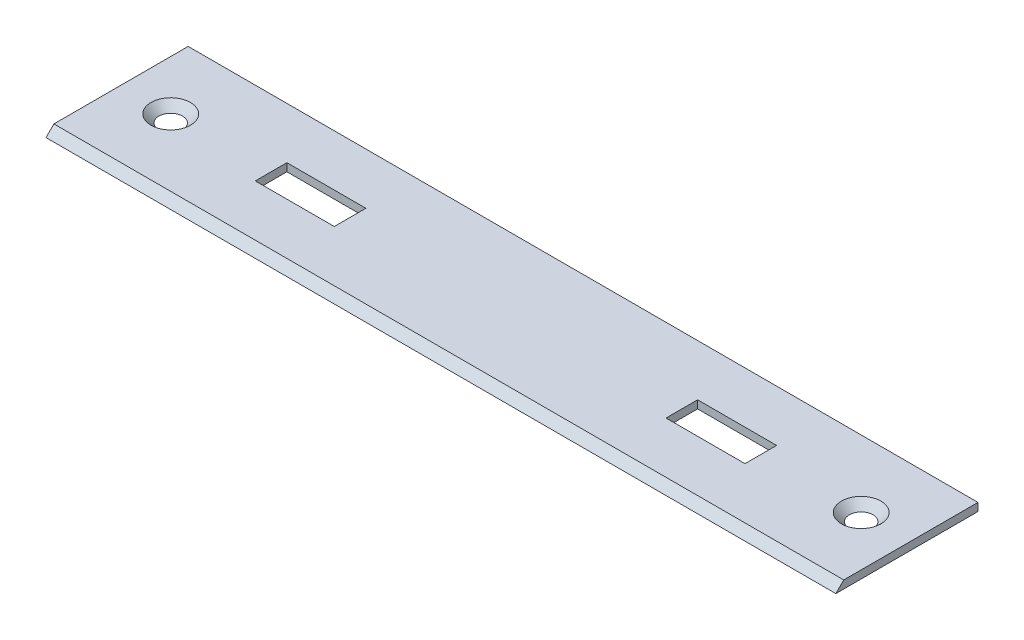
ISO-10303-21;
HEADER;
FILE_DESCRIPTION(('STEP AP214'),'2;1');
FILE_NAME('part.step','',(''),(''),'','','');
FILE_SCHEMA(('AUTOMOTIVE_DESIGN { 1 0 10303 214 1 1 1 1 }'));
ENDSEC;
DATA;
#1=APPLICATION_CONTEXT('core data for automotive mechanical design processes');
#2=APPLICATION_PROTOCOL_DEFINITION('international standard','automotive_design',2000,#1);
#3=PRODUCT_CONTEXT('',#1,'mechanical');
#4=PRODUCT('Part','Part','',(#3));
#5=PRODUCT_RELATED_PRODUCT_CATEGORY('part','',(#4));
#6=PRODUCT_DEFINITION_FORMATION('','',#4);
#7=PRODUCT_DEFINITION_CONTEXT('part definition',#1,'design');
#8=PRODUCT_DEFINITION('design','',#6,#7);
#9=PRODUCT_DEFINITION_SHAPE('','',#8);
#10=(LENGTH_UNIT() NAMED_UNIT(*) SI_UNIT(.MILLI.,.METRE.));
#11=(NAMED_UNIT(*) PLANE_ANGLE_UNIT() SI_UNIT($,.RADIAN.));
#12=(NAMED_UNIT(*) SI_UNIT($,.STERADIAN.) SOLID_ANGLE_UNIT());
#13=UNCERTAINTY_MEASURE_WITH_UNIT(LENGTH_MEASURE(1.E-05),#10,'distance_accuracy_value','');
#14=(GEOMETRIC_REPRESENTATION_CONTEXT(3) GLOBAL_UNCERTAINTY_ASSIGNED_CONTEXT((#13)) GLOBAL_UNIT_ASSIGNED_CONTEXT((#10,
#11,#12)) REPRESENTATION_CONTEXT('',''));
#15=CARTESIAN_POINT('',(0.,0.,0.));
#16=DIRECTION('',(0.,0.,1.));
#17=DIRECTION('',(1.,0.,0.));
#18=AXIS2_PLACEMENT_3D('',#15,#16,#17);
#19=CARTESIAN_POINT('',(50.,1.,9.));
#20=DIRECTION('',(-1.,0.,0.));
#21=DIRECTION('',(0.,0.,1.));
#22=AXIS2_PLACEMENT_3D('',#19,#20,#21);
#23=PLANE('',#22);
#24=DIRECTION('',(0.,0.,-1.));
#25=VECTOR('',#24,1.);
#26=CARTESIAN_POINT('',(50.,1.,9.));
#27=LINE('',#26,#25);
#28=CARTESIAN_POINT('',(50.,1.,8.));
#29=VERTEX_POINT('',#28);
#30=CARTESIAN_POINT('',(50.,1.,-9.));
#31=VERTEX_POINT('',#30);
#32=EDGE_CURVE('E200',#29,#31,#27,.T.);
#33=ORIENTED_EDGE('',*,*,#32,.F.);
#34=DIRECTION('',(0.,0.707106781186548,-0.707106781186548));
#35=VECTOR('',#34,1.);
#36=CARTESIAN_POINT('',(50.,1.,8.));
#37=LINE('',#36,#35);
#38=CARTESIAN_POINT('',(50.,0.,9.));
#39=VERTEX_POINT('',#38);
#40=EDGE_CURVE('E225',#29,#39,#37,.F.);
#41=ORIENTED_EDGE('',*,*,#40,.T.);
#42=DIRECTION('',(0.,0.,-1.));
#43=VECTOR('',#42,1.);
#44=CARTESIAN_POINT('',(50.,0.,9.));
#45=LINE('',#44,#43);
#46=CARTESIAN_POINT('',(50.,0.,-9.));
#47=VERTEX_POINT('',#46);
#48=EDGE_CURVE('E166',#39,#47,#45,.T.);
#49=ORIENTED_EDGE('',*,*,#48,.T.);
#50=DIRECTION('',(0.,-1.,0.));
#51=VECTOR('',#50,1.);
#52=CARTESIAN_POINT('',(50.,1.,-9.));
#53=LINE('',#52,#51);
#54=EDGE_CURVE('E219',#31,#47,#53,.T.);
#55=ORIENTED_EDGE('',*,*,#54,.F.);
#56=EDGE_LOOP('',(#33,#41,#49,#55));
#57=FACE_BOUND('',#56,.T.);
#58=ADVANCED_FACE('F39',(#57),#23,.F.);
#59=CARTESIAN_POINT('',(-50.,1.,-9.));
#60=DIRECTION('',(0.,0.,1.));
#61=DIRECTION('',(1.,0.,0.));
#62=AXIS2_PLACEMENT_3D('',#59,#60,#61);
#63=PLANE('',#62);
#64=DIRECTION('',(-1.,0.,0.));
#65=VECTOR('',#64,1.);
#66=CARTESIAN_POINT('',(-50.,0.,-9.));
#67=LINE('',#66,#65);
#68=CARTESIAN_POINT('',(-50.,0.,-9.));
#69=VERTEX_POINT('',#68);
#70=EDGE_CURVE('E211',#47,#69,#67,.T.);
#71=ORIENTED_EDGE('',*,*,#70,.T.);
#72=DIRECTION('',(0.,-1.,0.));
#73=VECTOR('',#72,1.);
#74=CARTESIAN_POINT('',(-50.,1.,-9.));
#75=LINE('',#74,#73);
#76=CARTESIAN_POINT('',(-50.,1.,-9.));
#77=VERTEX_POINT('',#76);
#78=EDGE_CURVE('E208',#77,#69,#75,.T.);
#79=ORIENTED_EDGE('',*,*,#78,.F.);
#80=DIRECTION('',(-1.,0.,0.));
#81=VECTOR('',#80,1.);
#82=CARTESIAN_POINT('',(-50.,1.,-9.));
#83=LINE('',#82,#81);
#84=EDGE_CURVE('E202',#31,#77,#83,.T.);
#85=ORIENTED_EDGE('',*,*,#84,.F.);
#86=ORIENTED_EDGE('',*,*,#54,.T.);
#87=EDGE_LOOP('',(#71,#79,#85,#86));
#88=FACE_BOUND('',#87,.T.);
#89=ADVANCED_FACE('F262',(#88),#63,.F.);
#90=CARTESIAN_POINT('',(-50.,1.,9.));
#91=DIRECTION('',(1.,0.,0.));
#92=DIRECTION('',(0.,0.,-1.));
#93=AXIS2_PLACEMENT_3D('',#90,#91,#92);
#94=PLANE('',#93);
#95=DIRECTION('',(0.,0.,1.));
#96=VECTOR('',#95,1.);
#97=CARTESIAN_POINT('',(-50.,0.,9.));
#98=LINE('',#97,#96);
#99=CARTESIAN_POINT('',(-50.,0.,9.));
#100=VERTEX_POINT('',#99);
#101=EDGE_CURVE('E213',#69,#100,#98,.T.);
#102=ORIENTED_EDGE('',*,*,#101,.T.);
#103=DIRECTION('',(0.,-0.707106781186548,0.707106781186548));
#104=VECTOR('',#103,1.);
#105=CARTESIAN_POINT('',(-50.,1.,8.));
#106=LINE('',#105,#104);
#107=CARTESIAN_POINT('',(-50.,1.,8.));
#108=VERTEX_POINT('',#107);
#109=EDGE_CURVE('E227',#100,#108,#106,.F.);
#110=ORIENTED_EDGE('',*,*,#109,.T.);
#111=DIRECTION('',(0.,0.,1.));
#112=VECTOR('',#111,1.);
#113=CARTESIAN_POINT('',(-50.,1.,9.));
#114=LINE('',#113,#112);
#115=EDGE_CURVE('E205',#77,#108,#114,.T.);
#116=ORIENTED_EDGE('',*,*,#115,.F.);
#117=ORIENTED_EDGE('',*,*,#78,.T.);
#118=EDGE_LOOP('',(#102,#110,#116,#117));
#119=FACE_BOUND('',#118,.T.);
#120=ADVANCED_FACE('F267',(#119),#94,.F.);
#121=CARTESIAN_POINT('',(0.,1.,0.));
#122=DIRECTION('',(0.,-1.,0.));
#123=DIRECTION('',(0.,0.,-1.));
#124=AXIS2_PLACEMENT_3D('',#121,#122,#123);
#125=PLANE('',#124);
#126=CARTESIAN_POINT('',(43.7096798806038,1.,-0.5));
#127=DIRECTION('',(0.,-1.,0.));
#128=DIRECTION('',(0.,0.,-1.));
#129=AXIS2_PLACEMENT_3D('',#126,#127,#128);
#130=CIRCLE('',#129,2.5);
#131=CARTESIAN_POINT('',(43.7096798806038,1.,-3.));
#132=VERTEX_POINT('',#131);
#133=EDGE_CURVE('E11',#132,#132,#130,.T.);
#134=ORIENTED_EDGE('',*,*,#133,.T.);
#135=EDGE_LOOP('',(#134));
#136=FACE_BOUND('',#135,.T.);
#137=CARTESIAN_POINT('',(-43.7096798806038,1.,-0.5));
#138=DIRECTION('',(0.,-1.,0.));
#139=DIRECTION('',(0.,0.,-1.));
#140=AXIS2_PLACEMENT_3D('',#137,#138,#139);
#141=CIRCLE('',#140,2.5);
#142=CARTESIAN_POINT('',(-43.7096798806038,1.,-3.));
#143=VERTEX_POINT('',#142);
#144=EDGE_CURVE('E48',#143,#143,#141,.T.);
#145=ORIENTED_EDGE('',*,*,#144,.T.);
#146=EDGE_LOOP('',(#145));
#147=FACE_BOUND('',#146,.T.);
#148=DIRECTION('',(-1.,0.,0.));
#149=VECTOR('',#148,1.);
#150=CARTESIAN_POINT('',(-31.,1.,-2.50000000000001));
#151=LINE('',#150,#149);
#152=CARTESIAN_POINT('',(-21.,1.,-2.50000000000001));
#153=VERTEX_POINT('',#152);
#154=CARTESIAN_POINT('',(-31.,1.,-2.50000000000001));
#155=VERTEX_POINT('',#154);
#156=EDGE_CURVE('E159',#153,#155,#151,.T.);
#157=ORIENTED_EDGE('',*,*,#156,.F.);
#158=DIRECTION('',(0.,0.,-1.));
#159=VECTOR('',#158,1.);
#160=CARTESIAN_POINT('',(-21.,1.,-2.50000000000001));
#161=LINE('',#160,#159);
#162=CARTESIAN_POINT('',(-21.,1.,1.49999999999999));
#163=VERTEX_POINT('',#162);
#164=EDGE_CURVE('E55',#163,#153,#161,.T.);
#165=ORIENTED_EDGE('',*,*,#164,.F.);
#166=DIRECTION('',(1.,0.,0.));
#167=VECTOR('',#166,1.);
#168=CARTESIAN_POINT('',(-31.,1.,1.49999999999999));
#169=LINE('',#168,#167);
#170=CARTESIAN_POINT('',(-31.,1.,1.49999999999999));
#171=VERTEX_POINT('',#170);
#172=EDGE_CURVE('E150',#171,#163,#169,.T.);
#173=ORIENTED_EDGE('',*,*,#172,.F.);
#174=DIRECTION('',(0.,0.,1.));
#175=VECTOR('',#174,1.);
#176=CARTESIAN_POINT('',(-31.,1.,-2.50000000000001));
#177=LINE('',#176,#175);
#178=EDGE_CURVE('E153',#155,#171,#177,.T.);
#179=ORIENTED_EDGE('',*,*,#178,.F.);
#180=EDGE_LOOP('',(#157,#165,#173,#179));
#181=FACE_BOUND('',#180,.T.);
#182=DIRECTION('',(-1.,0.,0.));
#183=VECTOR('',#182,1.);
#184=CARTESIAN_POINT('',(21.,1.,-2.50000000000001));
#185=LINE('',#184,#183);
#186=CARTESIAN_POINT('',(31.,1.,-2.50000000000001));
#187=VERTEX_POINT('',#186);
#188=CARTESIAN_POINT('',(21.,1.,-2.50000000000001));
#189=VERTEX_POINT('',#188);
#190=EDGE_CURVE('E185',#187,#189,#185,.T.);
#191=ORIENTED_EDGE('',*,*,#190,.F.);
#192=DIRECTION('',(0.,0.,-1.));
#193=VECTOR('',#192,1.);
#194=CARTESIAN_POINT('',(31.,1.,-2.50000000000001));
#195=LINE('',#194,#193);
#196=CARTESIAN_POINT('',(31.,1.,1.49999999999999));
#197=VERTEX_POINT('',#196);
#198=EDGE_CURVE('E63',#197,#187,#195,.T.);
#199=ORIENTED_EDGE('',*,*,#198,.F.);
#200=DIRECTION('',(1.,0.,0.));
#201=VECTOR('',#200,1.);
#202=CARTESIAN_POINT('',(21.,1.,1.49999999999999));
#203=LINE('',#202,#201);
#204=CARTESIAN_POINT('',(21.,1.,1.49999999999999));
#205=VERTEX_POINT('',#204);
#206=EDGE_CURVE('E174',#205,#197,#203,.T.);
#207=ORIENTED_EDGE('',*,*,#206,.F.);
#208=DIRECTION('',(0.,0.,1.));
#209=VECTOR('',#208,1.);
#210=CARTESIAN_POINT('',(21.,1.,-2.50000000000001));
#211=LINE('',#210,#209);
#212=EDGE_CURVE('E189',#189,#205,#211,.T.);
#213=ORIENTED_EDGE('',*,*,#212,.F.);
#214=EDGE_LOOP('',(#191,#199,#207,#213));
#215=FACE_BOUND('',#214,.T.);
#216=ORIENTED_EDGE('',*,*,#115,.T.);
#217=DIRECTION('',(1.,0.,0.));
#218=VECTOR('',#217,1.);
#219=CARTESIAN_POINT('',(0.,1.,8.));
#220=LINE('',#219,#218);
#221=EDGE_CURVE('E222',#108,#29,#220,.T.);
#222=ORIENTED_EDGE('',*,*,#221,.T.);
#223=ORIENTED_EDGE('',*,*,#32,.T.);
#224=ORIENTED_EDGE('',*,*,#84,.T.);
#225=EDGE_LOOP('',(#216,#222,#223,#224));
#226=FACE_BOUND('',#225,.T.);
#227=ADVANCED_FACE('F236',(#136,#147,#181,#215,#226),#125,.F.);
#228=CARTESIAN_POINT('',(0.,0.,0.));
#229=DIRECTION('',(0.,-1.,0.));
#230=DIRECTION('',(0.,0.,-1.));
#231=AXIS2_PLACEMENT_3D('',#228,#229,#230);
#232=PLANE('',#231);
#233=CARTESIAN_POINT('',(-43.7096798806038,0.,-0.5));
#234=DIRECTION('',(0.,-1.,0.));
#235=DIRECTION('',(0.,0.,-1.));
#236=AXIS2_PLACEMENT_3D('',#233,#234,#235);
#237=CIRCLE('',#236,1.5);
#238=CARTESIAN_POINT('',(-43.7096798806038,0.,-2.));
#239=VERTEX_POINT('',#238);
#240=EDGE_CURVE('E186',#239,#239,#237,.T.);
#241=ORIENTED_EDGE('',*,*,#240,.F.);
#242=EDGE_LOOP('',(#241));
#243=FACE_BOUND('',#242,.T.);
#244=CARTESIAN_POINT('',(43.7096798806038,0.,-0.5));
#245=DIRECTION('',(0.,-1.,0.));
#246=DIRECTION('',(0.,0.,-1.));
#247=AXIS2_PLACEMENT_3D('',#244,#245,#246);
#248=CIRCLE('',#247,1.5);
#249=CARTESIAN_POINT('',(43.7096798806038,0.,-2.));
#250=VERTEX_POINT('',#249);
#251=EDGE_CURVE('E229',#250,#250,#248,.T.);
#252=ORIENTED_EDGE('',*,*,#251,.F.);
#253=EDGE_LOOP('',(#252));
#254=FACE_BOUND('',#253,.T.);
#255=DIRECTION('',(0.,0.,-1.));
#256=VECTOR('',#255,1.);
#257=CARTESIAN_POINT('',(-21.,0.,-2.50000000000001));
#258=LINE('',#257,#256);
#259=CARTESIAN_POINT('',(-21.,0.,1.49999999999999));
#260=VERTEX_POINT('',#259);
#261=CARTESIAN_POINT('',(-21.,0.,-2.50000000000001));
#262=VERTEX_POINT('',#261);
#263=EDGE_CURVE('E131',#260,#262,#258,.T.);
#264=ORIENTED_EDGE('',*,*,#263,.T.);
#265=DIRECTION('',(-1.,0.,0.));
#266=VECTOR('',#265,1.);
#267=CARTESIAN_POINT('',(-31.,0.,-2.50000000000001));
#268=LINE('',#267,#266);
#269=CARTESIAN_POINT('',(-31.,0.,-2.50000000000001));
#270=VERTEX_POINT('',#269);
#271=EDGE_CURVE('E141',#262,#270,#268,.T.);
#272=ORIENTED_EDGE('',*,*,#271,.T.);
#273=DIRECTION('',(0.,0.,1.));
#274=VECTOR('',#273,1.);
#275=CARTESIAN_POINT('',(-31.,0.,-2.50000000000001));
#276=LINE('',#275,#274);
#277=CARTESIAN_POINT('',(-31.,0.,1.49999999999999));
#278=VERTEX_POINT('',#277);
#279=EDGE_CURVE('E145',#270,#278,#276,.T.);
#280=ORIENTED_EDGE('',*,*,#279,.T.);
#281=DIRECTION('',(1.,0.,0.));
#282=VECTOR('',#281,1.);
#283=CARTESIAN_POINT('',(-31.,0.,1.49999999999999));
#284=LINE('',#283,#282);
#285=EDGE_CURVE('E137',#278,#260,#284,.T.);
#286=ORIENTED_EDGE('',*,*,#285,.T.);
#287=EDGE_LOOP('',(#264,#272,#280,#286));
#288=FACE_BOUND('',#287,.T.);
#289=DIRECTION('',(0.,0.,-1.));
#290=VECTOR('',#289,1.);
#291=CARTESIAN_POINT('',(31.,0.,-2.50000000000001));
#292=LINE('',#291,#290);
#293=CARTESIAN_POINT('',(31.,0.,1.49999999999999));
#294=VERTEX_POINT('',#293);
#295=CARTESIAN_POINT('',(31.,0.,-2.50000000000001));
#296=VERTEX_POINT('',#295);
#297=EDGE_CURVE('E170',#294,#296,#292,.T.);
#298=ORIENTED_EDGE('',*,*,#297,.T.);
#299=DIRECTION('',(-1.,0.,0.));
#300=VECTOR('',#299,1.);
#301=CARTESIAN_POINT('',(21.,0.,-2.50000000000001));
#302=LINE('',#301,#300);
#303=CARTESIAN_POINT('',(21.,0.,-2.50000000000001));
#304=VERTEX_POINT('',#303);
#305=EDGE_CURVE('E173',#296,#304,#302,.T.);
#306=ORIENTED_EDGE('',*,*,#305,.T.);
#307=DIRECTION('',(0.,0.,1.));
#308=VECTOR('',#307,1.);
#309=CARTESIAN_POINT('',(21.,0.,-2.50000000000001));
#310=LINE('',#309,#308);
#311=CARTESIAN_POINT('',(21.,0.,1.49999999999999));
#312=VERTEX_POINT('',#311);
#313=EDGE_CURVE('E177',#304,#312,#310,.T.);
#314=ORIENTED_EDGE('',*,*,#313,.T.);
#315=DIRECTION('',(1.,0.,0.));
#316=VECTOR('',#315,1.);
#317=CARTESIAN_POINT('',(21.,0.,1.49999999999999));
#318=LINE('',#317,#316);
#319=EDGE_CURVE('E180',#312,#294,#318,.T.);
#320=ORIENTED_EDGE('',*,*,#319,.T.);
#321=EDGE_LOOP('',(#298,#306,#314,#320));
#322=FACE_BOUND('',#321,.T.);
#323=ORIENTED_EDGE('',*,*,#48,.F.);
#324=DIRECTION('',(1.,0.,0.));
#325=VECTOR('',#324,1.);
#326=CARTESIAN_POINT('',(-50.,0.,9.));
#327=LINE('',#326,#325);
#328=EDGE_CURVE('E203',#100,#39,#327,.T.);
#329=ORIENTED_EDGE('',*,*,#328,.F.);
#330=ORIENTED_EDGE('',*,*,#101,.F.);
#331=ORIENTED_EDGE('',*,*,#70,.F.);
#332=EDGE_LOOP('',(#323,#329,#330,#331));
#333=FACE_BOUND('',#332,.T.);
#334=ADVANCED_FACE('F147',(#243,#254,#288,#322,#333),#232,.T.);
#335=CARTESIAN_POINT('',(0.,1.,8.));
#336=DIRECTION('',(0.,-0.707106781186547,-0.707106781186547));
#337=DIRECTION('',(1.,0.,0.));
#338=AXIS2_PLACEMENT_3D('',#335,#336,#337);
#339=PLANE('',#338);
#340=ORIENTED_EDGE('',*,*,#109,.F.);
#341=ORIENTED_EDGE('',*,*,#328,.T.);
#342=ORIENTED_EDGE('',*,*,#40,.F.);
#343=ORIENTED_EDGE('',*,*,#221,.F.);
#344=EDGE_LOOP('',(#340,#341,#342,#343));
#345=FACE_BOUND('',#344,.T.);
#346=ADVANCED_FACE('F246',(#345),#339,.F.);
#347=CARTESIAN_POINT('',(31.,0.,-2.50000000000001));
#348=DIRECTION('',(1.,0.,0.));
#349=DIRECTION('',(0.,0.,-1.));
#350=AXIS2_PLACEMENT_3D('',#347,#348,#349);
#351=PLANE('',#350);
#352=ORIENTED_EDGE('',*,*,#198,.T.);
#353=DIRECTION('',(0.,1.,0.));
#354=VECTOR('',#353,1.);
#355=CARTESIAN_POINT('',(31.,0.,-2.50000000000001));
#356=LINE('',#355,#354);
#357=EDGE_CURVE('E183',#296,#187,#356,.T.);
#358=ORIENTED_EDGE('',*,*,#357,.F.);
#359=ORIENTED_EDGE('',*,*,#297,.F.);
#360=DIRECTION('',(0.,1.,0.));
#361=VECTOR('',#360,1.);
#362=CARTESIAN_POINT('',(31.,0.,1.49999999999999));
#363=LINE('',#362,#361);
#364=EDGE_CURVE('E160',#294,#197,#363,.T.);
#365=ORIENTED_EDGE('',*,*,#364,.T.);
#366=EDGE_LOOP('',(#352,#358,#359,#365));
#367=FACE_BOUND('',#366,.T.);
#368=ADVANCED_FACE('F273',(#367),#351,.F.);
#369=CARTESIAN_POINT('',(21.,0.,1.49999999999999));
#370=DIRECTION('',(0.,0.,1.));
#371=DIRECTION('',(1.,0.,0.));
#372=AXIS2_PLACEMENT_3D('',#369,#370,#371);
#373=PLANE('',#372);
#374=ORIENTED_EDGE('',*,*,#206,.T.);
#375=ORIENTED_EDGE('',*,*,#364,.F.);
#376=ORIENTED_EDGE('',*,*,#319,.F.);
#377=DIRECTION('',(0.,1.,0.));
#378=VECTOR('',#377,1.);
#379=CARTESIAN_POINT('',(21.,0.,1.49999999999999));
#380=LINE('',#379,#378);
#381=EDGE_CURVE('E195',#312,#205,#380,.T.);
#382=ORIENTED_EDGE('',*,*,#381,.T.);
#383=EDGE_LOOP('',(#374,#375,#376,#382));
#384=FACE_BOUND('',#383,.T.);
#385=ADVANCED_FACE('F277',(#384),#373,.F.);
#386=CARTESIAN_POINT('',(21.,0.,-2.50000000000001));
#387=DIRECTION('',(-1.,0.,0.));
#388=DIRECTION('',(0.,0.,1.));
#389=AXIS2_PLACEMENT_3D('',#386,#387,#388);
#390=PLANE('',#389);
#391=ORIENTED_EDGE('',*,*,#212,.T.);
#392=ORIENTED_EDGE('',*,*,#381,.F.);
#393=ORIENTED_EDGE('',*,*,#313,.F.);
#394=DIRECTION('',(0.,1.,0.));
#395=VECTOR('',#394,1.);
#396=CARTESIAN_POINT('',(21.,0.,-2.50000000000001));
#397=LINE('',#396,#395);
#398=EDGE_CURVE('E197',#304,#189,#397,.T.);
#399=ORIENTED_EDGE('',*,*,#398,.T.);
#400=EDGE_LOOP('',(#391,#392,#393,#399));
#401=FACE_BOUND('',#400,.T.);
#402=ADVANCED_FACE('F300',(#401),#390,.F.);
#403=CARTESIAN_POINT('',(21.,0.,-2.50000000000001));
#404=DIRECTION('',(0.,0.,-1.));
#405=DIRECTION('',(-1.,0.,0.));
#406=AXIS2_PLACEMENT_3D('',#403,#404,#405);
#407=PLANE('',#406);
#408=ORIENTED_EDGE('',*,*,#190,.T.);
#409=ORIENTED_EDGE('',*,*,#398,.F.);
#410=ORIENTED_EDGE('',*,*,#305,.F.);
#411=ORIENTED_EDGE('',*,*,#357,.T.);
#412=EDGE_LOOP('',(#408,#409,#410,#411));
#413=FACE_BOUND('',#412,.T.);
#414=ADVANCED_FACE('F297',(#413),#407,.F.);
#415=CARTESIAN_POINT('',(-21.,0.,-2.50000000000001));
#416=DIRECTION('',(1.,0.,0.));
#417=DIRECTION('',(0.,0.,-1.));
#418=AXIS2_PLACEMENT_3D('',#415,#416,#417);
#419=PLANE('',#418);
#420=ORIENTED_EDGE('',*,*,#164,.T.);
#421=DIRECTION('',(0.,1.,0.));
#422=VECTOR('',#421,1.);
#423=CARTESIAN_POINT('',(-21.,0.,-2.50000000000001));
#424=LINE('',#423,#422);
#425=EDGE_CURVE('E127',#262,#153,#424,.T.);
#426=ORIENTED_EDGE('',*,*,#425,.F.);
#427=ORIENTED_EDGE('',*,*,#263,.F.);
#428=DIRECTION('',(0.,1.,0.));
#429=VECTOR('',#428,1.);
#430=CARTESIAN_POINT('',(-21.,0.,1.49999999999999));
#431=LINE('',#430,#429);
#432=EDGE_CURVE('E164',#260,#163,#431,.T.);
#433=ORIENTED_EDGE('',*,*,#432,.T.);
#434=EDGE_LOOP('',(#420,#426,#427,#433));
#435=FACE_BOUND('',#434,.T.);
#436=ADVANCED_FACE('F129',(#435),#419,.F.);
#437=CARTESIAN_POINT('',(-31.,0.,1.49999999999999));
#438=DIRECTION('',(0.,0.,1.));
#439=DIRECTION('',(1.,0.,0.));
#440=AXIS2_PLACEMENT_3D('',#437,#438,#439);
#441=PLANE('',#440);
#442=ORIENTED_EDGE('',*,*,#172,.T.);
#443=ORIENTED_EDGE('',*,*,#432,.F.);
#444=ORIENTED_EDGE('',*,*,#285,.F.);
#445=DIRECTION('',(0.,1.,0.));
#446=VECTOR('',#445,1.);
#447=CARTESIAN_POINT('',(-31.,0.,1.49999999999999));
#448=LINE('',#447,#446);
#449=EDGE_CURVE('E167',#278,#171,#448,.T.);
#450=ORIENTED_EDGE('',*,*,#449,.T.);
#451=EDGE_LOOP('',(#442,#443,#444,#450));
#452=FACE_BOUND('',#451,.T.);
#453=ADVANCED_FACE('F309',(#452),#441,.F.);
#454=CARTESIAN_POINT('',(-31.,0.,-2.50000000000001));
#455=DIRECTION('',(-1.,0.,0.));
#456=DIRECTION('',(0.,0.,1.));
#457=AXIS2_PLACEMENT_3D('',#454,#455,#456);
#458=PLANE('',#457);
#459=ORIENTED_EDGE('',*,*,#178,.T.);
#460=ORIENTED_EDGE('',*,*,#449,.F.);
#461=ORIENTED_EDGE('',*,*,#279,.F.);
#462=DIRECTION('',(0.,1.,0.));
#463=VECTOR('',#462,1.);
#464=CARTESIAN_POINT('',(-31.,0.,-2.50000000000001));
#465=LINE('',#464,#463);
#466=EDGE_CURVE('E136',#270,#155,#465,.T.);
#467=ORIENTED_EDGE('',*,*,#466,.T.);
#468=EDGE_LOOP('',(#459,#460,#461,#467));
#469=FACE_BOUND('',#468,.T.);
#470=ADVANCED_FACE('F256',(#469),#458,.F.);
#471=CARTESIAN_POINT('',(-31.,0.,-2.50000000000001));
#472=DIRECTION('',(0.,0.,-1.));
#473=DIRECTION('',(-1.,0.,0.));
#474=AXIS2_PLACEMENT_3D('',#471,#472,#473);
#475=PLANE('',#474);
#476=ORIENTED_EDGE('',*,*,#156,.T.);
#477=ORIENTED_EDGE('',*,*,#466,.F.);
#478=ORIENTED_EDGE('',*,*,#271,.F.);
#479=ORIENTED_EDGE('',*,*,#425,.T.);
#480=EDGE_LOOP('',(#476,#477,#478,#479));
#481=FACE_BOUND('',#480,.T.);
#482=ADVANCED_FACE('F142',(#481),#475,.F.);
#483=CARTESIAN_POINT('',(43.7096798806038,0.,-0.5));
#484=DIRECTION('',(0.,1.,0.));
#485=DIRECTION('',(0.,0.,1.));
#486=AXIS2_PLACEMENT_3D('',#483,#484,#485);
#487=CONICAL_SURFACE('',#486,1.5,0.785398163397445);
#488=ORIENTED_EDGE('',*,*,#133,.F.);
#489=EDGE_LOOP('',(#488));
#490=FACE_BOUND('',#489,.T.);
#491=ORIENTED_EDGE('',*,*,#251,.T.);
#492=EDGE_LOOP('',(#491));
#493=FACE_BOUND('',#492,.T.);
#494=ADVANCED_FACE('F241',(#490,#493),#487,.F.);
#495=CARTESIAN_POINT('',(-43.7096798806038,0.,-0.5));
#496=DIRECTION('',(0.,1.,0.));
#497=DIRECTION('',(0.,0.,1.));
#498=AXIS2_PLACEMENT_3D('',#495,#496,#497);
#499=CONICAL_SURFACE('',#498,1.5,0.785398163397445);
#500=ORIENTED_EDGE('',*,*,#144,.F.);
#501=EDGE_LOOP('',(#500));
#502=FACE_BOUND('',#501,.T.);
#503=ORIENTED_EDGE('',*,*,#240,.T.);
#504=EDGE_LOOP('',(#503));
#505=FACE_BOUND('',#504,.T.);
#506=ADVANCED_FACE('F42',(#502,#505),#499,.F.);
#507=CLOSED_SHELL('',(#58,#89,#120,#227,#334,#346,#368,#385,#402,#414,#436,#453,#470,#482,#494,#506));
#508=MANIFOLD_SOLID_BREP('B2',#507);
#509=ADVANCED_BREP_SHAPE_REPRESENTATION('',(#18,#508),#14);
#510=SHAPE_DEFINITION_REPRESENTATION(#9,#509);
ENDSEC;
END-ISO-10303-21;
